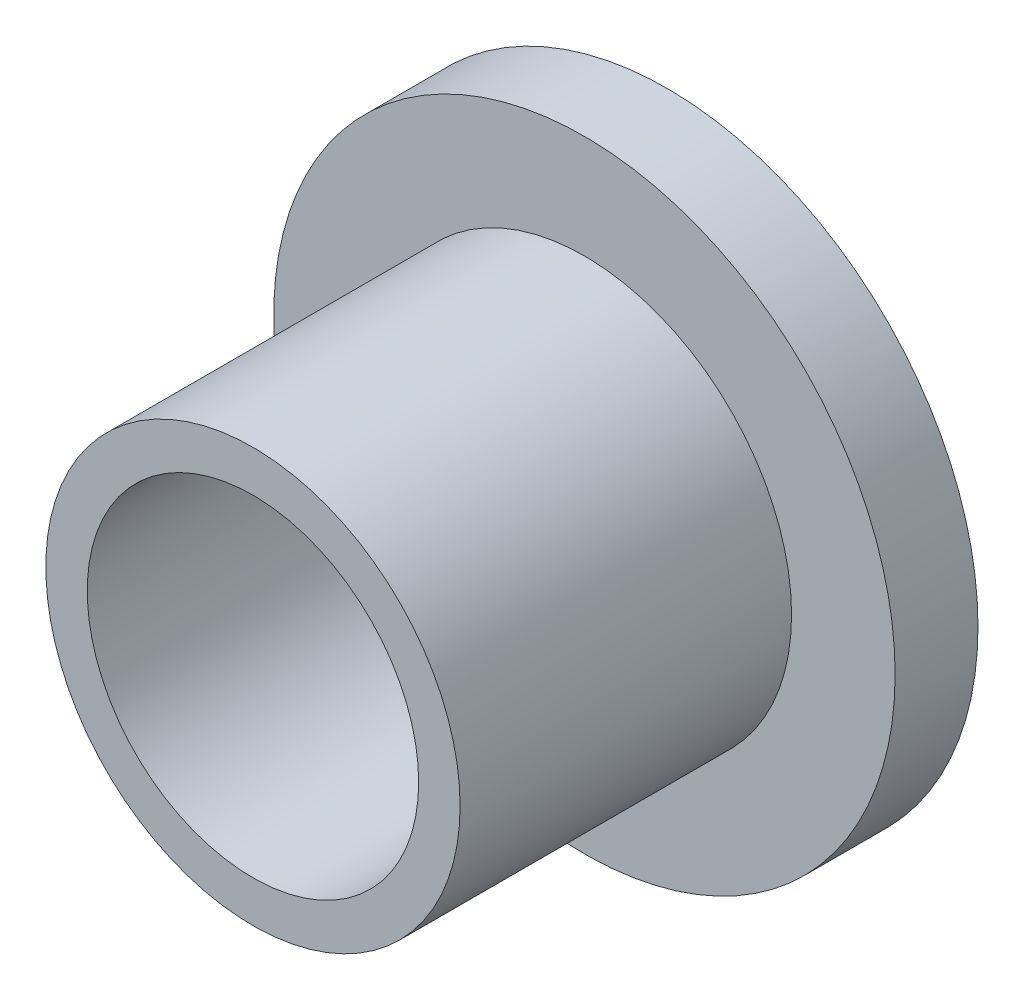
ISO-10303-21;
HEADER;
FILE_DESCRIPTION(('STEP AP214'),'2;1');
FILE_NAME('part.step','',(''),(''),'','','');
FILE_SCHEMA(('AUTOMOTIVE_DESIGN { 1 0 10303 214 1 1 1 1 }'));
ENDSEC;
DATA;
#1=APPLICATION_CONTEXT('core data for automotive mechanical design processes');
#2=APPLICATION_PROTOCOL_DEFINITION('international standard','automotive_design',2000,#1);
#3=PRODUCT_CONTEXT('',#1,'mechanical');
#4=PRODUCT('Part','Part','',(#3));
#5=PRODUCT_RELATED_PRODUCT_CATEGORY('part','',(#4));
#6=PRODUCT_DEFINITION_FORMATION('','',#4);
#7=PRODUCT_DEFINITION_CONTEXT('part definition',#1,'design');
#8=PRODUCT_DEFINITION('design','',#6,#7);
#9=PRODUCT_DEFINITION_SHAPE('','',#8);
#10=(LENGTH_UNIT() NAMED_UNIT(*) SI_UNIT(.MILLI.,.METRE.));
#11=(NAMED_UNIT(*) PLANE_ANGLE_UNIT() SI_UNIT($,.RADIAN.));
#12=(NAMED_UNIT(*) SI_UNIT($,.STERADIAN.) SOLID_ANGLE_UNIT());
#13=UNCERTAINTY_MEASURE_WITH_UNIT(LENGTH_MEASURE(1.E-05),#10,'distance_accuracy_value','');
#14=(GEOMETRIC_REPRESENTATION_CONTEXT(3) GLOBAL_UNCERTAINTY_ASSIGNED_CONTEXT((#13)) GLOBAL_UNIT_ASSIGNED_CONTEXT((#10,
#11,#12)) REPRESENTATION_CONTEXT('',''));
#15=CARTESIAN_POINT('',(0.,0.,0.));
#16=DIRECTION('',(0.,0.,1.));
#17=DIRECTION('',(1.,0.,0.));
#18=AXIS2_PLACEMENT_3D('',#15,#16,#17);
#19=CARTESIAN_POINT('',(0.,0.,10.));
#20=DIRECTION('',(0.,0.,-1.));
#21=DIRECTION('',(-1.,0.,0.));
#22=AXIS2_PLACEMENT_3D('',#19,#20,#21);
#23=CYLINDRICAL_SURFACE('',#22,4.);
#24=CARTESIAN_POINT('',(0.,0.,10.));
#25=DIRECTION('',(0.,0.,1.));
#26=DIRECTION('',(1.00000000000002,0.,0.));
#27=AXIS2_PLACEMENT_3D('',#24,#25,#26);
#28=CIRCLE('',#27,4.);
#29=CARTESIAN_POINT('',(4.00000000000007,0.,10.));
#30=VERTEX_POINT('',#29);
#31=EDGE_CURVE('E38',#30,#30,#28,.T.);
#32=ORIENTED_EDGE('',*,*,#31,.T.);
#33=EDGE_LOOP('',(#32));
#34=FACE_BOUND('',#33,.T.);
#35=CARTESIAN_POINT('',(0.,0.,0.));
#36=DIRECTION('',(0.,0.,1.));
#37=DIRECTION('',(1.00000000000002,0.,0.));
#38=AXIS2_PLACEMENT_3D('',#35,#36,#37);
#39=CIRCLE('',#38,4.);
#40=CARTESIAN_POINT('',(4.00000000000007,0.,0.));
#41=VERTEX_POINT('',#40);
#42=EDGE_CURVE('E34',#41,#41,#39,.T.);
#43=ORIENTED_EDGE('',*,*,#42,.F.);
#44=EDGE_LOOP('',(#43));
#45=FACE_BOUND('',#44,.T.);
#46=ADVANCED_FACE('F31',(#34,#45),#23,.F.);
#47=CARTESIAN_POINT('',(0.,0.,10.));
#48=DIRECTION('',(0.,0.,-1.));
#49=DIRECTION('',(-1.,0.,0.));
#50=AXIS2_PLACEMENT_3D('',#47,#48,#49);
#51=CYLINDRICAL_SURFACE('',#50,5.);
#52=CARTESIAN_POINT('',(0.,0.,2.));
#53=DIRECTION('',(0.,0.,1.));
#54=DIRECTION('',(1.00000000000001,0.,0.));
#55=AXIS2_PLACEMENT_3D('',#52,#53,#54);
#56=CIRCLE('',#55,5.);
#57=CARTESIAN_POINT('',(5.00000000000005,0.,2.));
#58=VERTEX_POINT('',#57);
#59=EDGE_CURVE('E47',#58,#58,#56,.T.);
#60=ORIENTED_EDGE('',*,*,#59,.T.);
#61=EDGE_LOOP('',(#60));
#62=FACE_BOUND('',#61,.T.);
#63=CARTESIAN_POINT('',(0.,0.,10.));
#64=DIRECTION('',(0.,0.,1.));
#65=DIRECTION('',(1.00000000000002,0.,0.));
#66=AXIS2_PLACEMENT_3D('',#63,#64,#65);
#67=CIRCLE('',#66,5.);
#68=CARTESIAN_POINT('',(5.00000000000009,0.,10.));
#69=VERTEX_POINT('',#68);
#70=EDGE_CURVE('E10',#69,#69,#67,.T.);
#71=ORIENTED_EDGE('',*,*,#70,.F.);
#72=EDGE_LOOP('',(#71));
#73=FACE_BOUND('',#72,.T.);
#74=ADVANCED_FACE('F54',(#62,#73),#51,.T.);
#75=CARTESIAN_POINT('',(0.,0.,10.));
#76=DIRECTION('',(0.,0.,1.));
#77=DIRECTION('',(1.00000000000002,0.,0.));
#78=AXIS2_PLACEMENT_3D('',#75,#76,#77);
#79=PLANE('',#78);
#80=ORIENTED_EDGE('',*,*,#31,.F.);
#81=EDGE_LOOP('',(#80));
#82=FACE_BOUND('',#81,.T.);
#83=ORIENTED_EDGE('',*,*,#70,.T.);
#84=EDGE_LOOP('',(#83));
#85=FACE_BOUND('',#84,.T.);
#86=ADVANCED_FACE('F71',(#82,#85),#79,.T.);
#87=CARTESIAN_POINT('',(0.,0.,0.));
#88=DIRECTION('',(0.,0.,1.));
#89=DIRECTION('',(1.00000000000002,0.,0.));
#90=AXIS2_PLACEMENT_3D('',#87,#88,#89);
#91=PLANE('',#90);
#92=ORIENTED_EDGE('',*,*,#42,.T.);
#93=EDGE_LOOP('',(#92));
#94=FACE_BOUND('',#93,.T.);
#95=CARTESIAN_POINT('',(0.,0.,0.));
#96=DIRECTION('',(0.,0.,1.));
#97=DIRECTION('',(1.00000000000001,0.,0.));
#98=AXIS2_PLACEMENT_3D('',#95,#96,#97);
#99=CIRCLE('',#98,7.5);
#100=CARTESIAN_POINT('',(7.50000000000007,0.,0.));
#101=VERTEX_POINT('',#100);
#102=EDGE_CURVE('E44',#101,#101,#99,.T.);
#103=ORIENTED_EDGE('',*,*,#102,.F.);
#104=EDGE_LOOP('',(#103));
#105=FACE_BOUND('',#104,.T.);
#106=ADVANCED_FACE('F66',(#94,#105),#91,.F.);
#107=CARTESIAN_POINT('',(0.,0.,2.));
#108=DIRECTION('',(0.,0.,-1.));
#109=DIRECTION('',(-1.,0.,0.));
#110=AXIS2_PLACEMENT_3D('',#107,#108,#109);
#111=CYLINDRICAL_SURFACE('',#110,7.5);
#112=CARTESIAN_POINT('',(0.,0.,2.));
#113=DIRECTION('',(0.,0.,1.));
#114=DIRECTION('',(1.00000000000001,0.,0.));
#115=AXIS2_PLACEMENT_3D('',#112,#113,#114);
#116=CIRCLE('',#115,7.5);
#117=CARTESIAN_POINT('',(7.50000000000007,0.,2.));
#118=VERTEX_POINT('',#117);
#119=EDGE_CURVE('E48',#118,#118,#116,.T.);
#120=ORIENTED_EDGE('',*,*,#119,.F.);
#121=EDGE_LOOP('',(#120));
#122=FACE_BOUND('',#121,.T.);
#123=ORIENTED_EDGE('',*,*,#102,.T.);
#124=EDGE_LOOP('',(#123));
#125=FACE_BOUND('',#124,.T.);
#126=ADVANCED_FACE('F60',(#122,#125),#111,.T.);
#127=CARTESIAN_POINT('',(0.,0.,2.));
#128=DIRECTION('',(0.,0.,1.));
#129=DIRECTION('',(1.00000000000001,0.,0.));
#130=AXIS2_PLACEMENT_3D('',#127,#128,#129);
#131=PLANE('',#130);
#132=ORIENTED_EDGE('',*,*,#59,.F.);
#133=EDGE_LOOP('',(#132));
#134=FACE_BOUND('',#133,.T.);
#135=ORIENTED_EDGE('',*,*,#119,.T.);
#136=EDGE_LOOP('',(#135));
#137=FACE_BOUND('',#136,.T.);
#138=ADVANCED_FACE('F57',(#134,#137),#131,.T.);
#139=CLOSED_SHELL('',(#46,#74,#86,#106,#126,#138));
#140=MANIFOLD_SOLID_BREP('B2',#139);
#141=ADVANCED_BREP_SHAPE_REPRESENTATION('',(#18,#140),#14);
#142=SHAPE_DEFINITION_REPRESENTATION(#9,#141);
ENDSEC;
END-ISO-10303-21;
